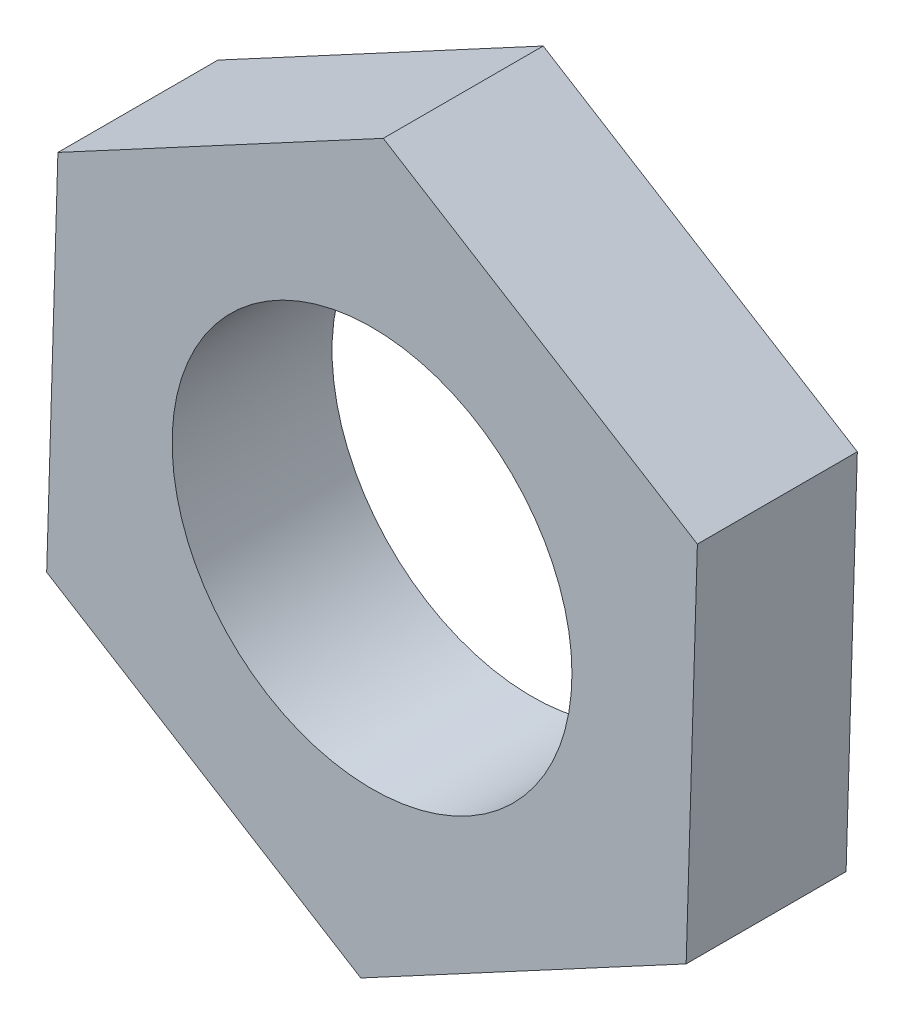
ISO-10303-21;
HEADER;
FILE_DESCRIPTION(('STEP AP214'),'2;1');
FILE_NAME('part.step','',(''),(''),'','','');
FILE_SCHEMA(('AUTOMOTIVE_DESIGN { 1 0 10303 214 1 1 1 1 }'));
ENDSEC;
DATA;
#1=APPLICATION_CONTEXT('core data for automotive mechanical design processes');
#2=APPLICATION_PROTOCOL_DEFINITION('international standard','automotive_design',2000,#1);
#3=PRODUCT_CONTEXT('',#1,'mechanical');
#4=PRODUCT('Part','Part','',(#3));
#5=PRODUCT_RELATED_PRODUCT_CATEGORY('part','',(#4));
#6=PRODUCT_DEFINITION_FORMATION('','',#4);
#7=PRODUCT_DEFINITION_CONTEXT('part definition',#1,'design');
#8=PRODUCT_DEFINITION('design','',#6,#7);
#9=PRODUCT_DEFINITION_SHAPE('','',#8);
#10=(LENGTH_UNIT() NAMED_UNIT(*) SI_UNIT(.MILLI.,.METRE.));
#11=(NAMED_UNIT(*) PLANE_ANGLE_UNIT() SI_UNIT($,.RADIAN.));
#12=(NAMED_UNIT(*) SI_UNIT($,.STERADIAN.) SOLID_ANGLE_UNIT());
#13=UNCERTAINTY_MEASURE_WITH_UNIT(LENGTH_MEASURE(1.E-05),#10,'distance_accuracy_value','');
#14=(GEOMETRIC_REPRESENTATION_CONTEXT(3) GLOBAL_UNCERTAINTY_ASSIGNED_CONTEXT((#13)) GLOBAL_UNIT_ASSIGNED_CONTEXT((#10,
#11,#12)) REPRESENTATION_CONTEXT('',''));
#15=CARTESIAN_POINT('',(0.,0.,0.));
#16=DIRECTION('',(0.,0.,1.));
#17=DIRECTION('',(1.,0.,0.));
#18=AXIS2_PLACEMENT_3D('',#15,#16,#17);
#19=CARTESIAN_POINT('',(0.,0.,20.));
#20=DIRECTION('',(0.,0.,1.));
#21=DIRECTION('',(1.,0.,0.));
#22=AXIS2_PLACEMENT_3D('',#19,#20,#21);
#23=PLANE('',#22);
#24=DIRECTION('',(0.0303984350601622,0.99953786078662,0.));
#25=VECTOR('',#24,1.);
#26=CARTESIAN_POINT('',(39.2794926448677,-24.2992755220216,20.));
#27=LINE('',#26,#25);
#28=CARTESIAN_POINT('',(39.2794926448677,-24.2992755220216,20.));
#29=VERTEX_POINT('',#28);
#30=CARTESIAN_POINT('',(40.683536218062,21.8674007172086,20.));
#31=VERTEX_POINT('',#30);
#32=EDGE_CURVE('E129',#29,#31,#27,.T.);
#33=ORIENTED_EDGE('',*,*,#32,.T.);
#34=DIRECTION('',(-0.850425961955486,0.526094747390702,0.));
#35=VECTOR('',#34,1.);
#36=CARTESIAN_POINT('',(40.683536218062,21.8674007172086,20.));
#37=LINE('',#36,#35);
#38=CARTESIAN_POINT('',(1.40404357319425,46.1666762392302,20.));
#39=VERTEX_POINT('',#38);
#40=EDGE_CURVE('E87',#31,#39,#37,.T.);
#41=ORIENTED_EDGE('',*,*,#40,.T.);
#42=DIRECTION('',(-0.880824397015648,-0.473443113395918,0.));
#43=VECTOR('',#42,1.);
#44=CARTESIAN_POINT('',(1.40404357319425,46.1666762392302,20.));
#45=LINE('',#44,#43);
#46=CARTESIAN_POINT('',(-39.2794926448677,24.2992755220216,20.));
#47=VERTEX_POINT('',#46);
#48=EDGE_CURVE('E100',#39,#47,#45,.T.);
#49=ORIENTED_EDGE('',*,*,#48,.T.);
#50=DIRECTION('',(-0.0303984350601624,-0.99953786078662,0.));
#51=VECTOR('',#50,1.);
#52=CARTESIAN_POINT('',(-39.2794926448677,24.2992755220216,20.));
#53=LINE('',#52,#51);
#54=CARTESIAN_POINT('',(-40.6835362180619,-21.8674007172086,20.));
#55=VERTEX_POINT('',#54);
#56=EDGE_CURVE('E94',#47,#55,#53,.T.);
#57=ORIENTED_EDGE('',*,*,#56,.T.);
#58=DIRECTION('',(0.850425961955486,-0.526094747390702,0.));
#59=VECTOR('',#58,1.);
#60=CARTESIAN_POINT('',(-40.6835362180619,-21.8674007172086,20.));
#61=LINE('',#60,#59);
#62=CARTESIAN_POINT('',(-1.40404357319424,-46.1666762392302,20.));
#63=VERTEX_POINT('',#62);
#64=EDGE_CURVE('E98',#55,#63,#61,.T.);
#65=ORIENTED_EDGE('',*,*,#64,.T.);
#66=DIRECTION('',(0.880824397015648,0.473443113395918,0.));
#67=VECTOR('',#66,1.);
#68=CARTESIAN_POINT('',(-1.40404357319424,-46.1666762392302,20.));
#69=LINE('',#68,#67);
#70=EDGE_CURVE('E50',#63,#29,#69,.T.);
#71=ORIENTED_EDGE('',*,*,#70,.T.);
#72=EDGE_LOOP('',(#33,#41,#49,#57,#65,#71));
#73=FACE_BOUND('',#72,.T.);
#74=CARTESIAN_POINT('',(0.,0.,20.));
#75=DIRECTION('',(0.,0.,1.));
#76=DIRECTION('',(1.,0.,0.));
#77=AXIS2_PLACEMENT_3D('',#74,#75,#76);
#78=CIRCLE('',#77,25.);
#79=CARTESIAN_POINT('',(25.,0.,20.));
#80=VERTEX_POINT('',#79);
#81=EDGE_CURVE('E122',#80,#80,#78,.T.);
#82=ORIENTED_EDGE('',*,*,#81,.F.);
#83=EDGE_LOOP('',(#82));
#84=FACE_BOUND('',#83,.T.);
#85=ADVANCED_FACE('F33',(#73,#84),#23,.T.);
#86=CARTESIAN_POINT('',(0.,0.,0.));
#87=DIRECTION('',(0.,0.,1.));
#88=DIRECTION('',(1.,0.,0.));
#89=AXIS2_PLACEMENT_3D('',#86,#87,#88);
#90=PLANE('',#89);
#91=DIRECTION('',(0.0303984350601622,0.99953786078662,0.));
#92=VECTOR('',#91,1.);
#93=CARTESIAN_POINT('',(39.2794926448677,-24.2992755220216,0.));
#94=LINE('',#93,#92);
#95=CARTESIAN_POINT('',(39.2794926448677,-24.2992755220216,0.));
#96=VERTEX_POINT('',#95);
#97=CARTESIAN_POINT('',(40.683536218062,21.8674007172086,0.));
#98=VERTEX_POINT('',#97);
#99=EDGE_CURVE('E118',#96,#98,#94,.T.);
#100=ORIENTED_EDGE('',*,*,#99,.F.);
#101=DIRECTION('',(0.880824397015648,0.473443113395918,0.));
#102=VECTOR('',#101,1.);
#103=CARTESIAN_POINT('',(-1.40404357319424,-46.1666762392302,0.));
#104=LINE('',#103,#102);
#105=CARTESIAN_POINT('',(-1.40404357319424,-46.1666762392302,0.));
#106=VERTEX_POINT('',#105);
#107=EDGE_CURVE('E79',#106,#96,#104,.T.);
#108=ORIENTED_EDGE('',*,*,#107,.F.);
#109=DIRECTION('',(0.850425961955486,-0.526094747390702,0.));
#110=VECTOR('',#109,1.);
#111=CARTESIAN_POINT('',(-40.6835362180619,-21.8674007172086,0.));
#112=LINE('',#111,#110);
#113=CARTESIAN_POINT('',(-40.6835362180619,-21.8674007172086,0.));
#114=VERTEX_POINT('',#113);
#115=EDGE_CURVE('E73',#114,#106,#112,.T.);
#116=ORIENTED_EDGE('',*,*,#115,.F.);
#117=DIRECTION('',(-0.0303984350601624,-0.99953786078662,0.));
#118=VECTOR('',#117,1.);
#119=CARTESIAN_POINT('',(-39.2794926448677,24.2992755220216,0.));
#120=LINE('',#119,#118);
#121=CARTESIAN_POINT('',(-39.2794926448677,24.2992755220216,0.));
#122=VERTEX_POINT('',#121);
#123=EDGE_CURVE('E108',#122,#114,#120,.T.);
#124=ORIENTED_EDGE('',*,*,#123,.F.);
#125=DIRECTION('',(-0.880824397015648,-0.473443113395918,0.));
#126=VECTOR('',#125,1.);
#127=CARTESIAN_POINT('',(1.40404357319425,46.1666762392302,0.));
#128=LINE('',#127,#126);
#129=CARTESIAN_POINT('',(1.40404357319425,46.1666762392302,0.));
#130=VERTEX_POINT('',#129);
#131=EDGE_CURVE('E124',#130,#122,#128,.T.);
#132=ORIENTED_EDGE('',*,*,#131,.F.);
#133=DIRECTION('',(-0.850425961955486,0.526094747390702,0.));
#134=VECTOR('',#133,1.);
#135=CARTESIAN_POINT('',(40.683536218062,21.8674007172086,0.));
#136=LINE('',#135,#134);
#137=EDGE_CURVE('E121',#98,#130,#136,.T.);
#138=ORIENTED_EDGE('',*,*,#137,.F.);
#139=EDGE_LOOP('',(#100,#108,#116,#124,#132,#138));
#140=FACE_BOUND('',#139,.T.);
#141=CARTESIAN_POINT('',(0.,0.,0.));
#142=DIRECTION('',(0.,0.,1.));
#143=DIRECTION('',(1.,0.,0.));
#144=AXIS2_PLACEMENT_3D('',#141,#142,#143);
#145=CIRCLE('',#144,25.);
#146=CARTESIAN_POINT('',(25.,0.,0.));
#147=VERTEX_POINT('',#146);
#148=EDGE_CURVE('E222',#147,#147,#145,.T.);
#149=ORIENTED_EDGE('',*,*,#148,.T.);
#150=EDGE_LOOP('',(#149));
#151=FACE_BOUND('',#150,.T.);
#152=ADVANCED_FACE('F138',(#140,#151),#90,.F.);
#153=CARTESIAN_POINT('',(39.2794926448677,-24.2992755220216,20.));
#154=DIRECTION('',(-0.99953786078662,0.0303984350601622,0.));
#155=DIRECTION('',(-0.0303984350601622,-0.99953786078662,0.));
#156=AXIS2_PLACEMENT_3D('',#153,#154,#155);
#157=PLANE('',#156);
#158=ORIENTED_EDGE('',*,*,#99,.T.);
#159=DIRECTION('',(0.,0.,-1.));
#160=VECTOR('',#159,1.);
#161=CARTESIAN_POINT('',(40.683536218062,21.8674007172086,20.));
#162=LINE('',#161,#160);
#163=EDGE_CURVE('E11',#31,#98,#162,.T.);
#164=ORIENTED_EDGE('',*,*,#163,.F.);
#165=ORIENTED_EDGE('',*,*,#32,.F.);
#166=DIRECTION('',(0.,0.,-1.));
#167=VECTOR('',#166,1.);
#168=CARTESIAN_POINT('',(39.2794926448677,-24.2992755220216,20.));
#169=LINE('',#168,#167);
#170=EDGE_CURVE('E114',#29,#96,#169,.T.);
#171=ORIENTED_EDGE('',*,*,#170,.T.);
#172=EDGE_LOOP('',(#158,#164,#165,#171));
#173=FACE_BOUND('',#172,.T.);
#174=ADVANCED_FACE('F35',(#173),#157,.F.);
#175=CARTESIAN_POINT('',(40.683536218062,21.8674007172086,20.));
#176=DIRECTION('',(-0.526094747390702,-0.850425961955486,0.));
#177=DIRECTION('',(0.850425961955486,-0.526094747390702,0.));
#178=AXIS2_PLACEMENT_3D('',#175,#176,#177);
#179=PLANE('',#178);
#180=ORIENTED_EDGE('',*,*,#137,.T.);
#181=DIRECTION('',(0.,0.,-1.));
#182=VECTOR('',#181,1.);
#183=CARTESIAN_POINT('',(1.40404357319425,46.1666762392302,20.));
#184=LINE('',#183,#182);
#185=EDGE_CURVE('E42',#39,#130,#184,.T.);
#186=ORIENTED_EDGE('',*,*,#185,.F.);
#187=ORIENTED_EDGE('',*,*,#40,.F.);
#188=ORIENTED_EDGE('',*,*,#163,.T.);
#189=EDGE_LOOP('',(#180,#186,#187,#188));
#190=FACE_BOUND('',#189,.T.);
#191=ADVANCED_FACE('F163',(#190),#179,.F.);
#192=CARTESIAN_POINT('',(1.40404357319425,46.1666762392302,20.));
#193=DIRECTION('',(0.473443113395918,-0.880824397015648,0.));
#194=DIRECTION('',(0.880824397015648,0.473443113395918,0.));
#195=AXIS2_PLACEMENT_3D('',#192,#193,#194);
#196=PLANE('',#195);
#197=ORIENTED_EDGE('',*,*,#131,.T.);
#198=DIRECTION('',(0.,0.,-1.));
#199=VECTOR('',#198,1.);
#200=CARTESIAN_POINT('',(-39.2794926448677,24.2992755220216,20.));
#201=LINE('',#200,#199);
#202=EDGE_CURVE('E109',#47,#122,#201,.T.);
#203=ORIENTED_EDGE('',*,*,#202,.F.);
#204=ORIENTED_EDGE('',*,*,#48,.F.);
#205=ORIENTED_EDGE('',*,*,#185,.T.);
#206=EDGE_LOOP('',(#197,#203,#204,#205));
#207=FACE_BOUND('',#206,.T.);
#208=ADVANCED_FACE('F135',(#207),#196,.F.);
#209=CARTESIAN_POINT('',(-39.2794926448677,24.2992755220216,20.));
#210=DIRECTION('',(0.99953786078662,-0.0303984350601624,0.));
#211=DIRECTION('',(0.0303984350601624,0.99953786078662,0.));
#212=AXIS2_PLACEMENT_3D('',#209,#210,#211);
#213=PLANE('',#212);
#214=ORIENTED_EDGE('',*,*,#123,.T.);
#215=DIRECTION('',(0.,0.,-1.));
#216=VECTOR('',#215,1.);
#217=CARTESIAN_POINT('',(-40.6835362180619,-21.8674007172086,20.));
#218=LINE('',#217,#216);
#219=EDGE_CURVE('E105',#55,#114,#218,.T.);
#220=ORIENTED_EDGE('',*,*,#219,.F.);
#221=ORIENTED_EDGE('',*,*,#56,.F.);
#222=ORIENTED_EDGE('',*,*,#202,.T.);
#223=EDGE_LOOP('',(#214,#220,#221,#222));
#224=FACE_BOUND('',#223,.T.);
#225=ADVANCED_FACE('F106',(#224),#213,.F.);
#226=CARTESIAN_POINT('',(-40.6835362180619,-21.8674007172086,20.));
#227=DIRECTION('',(0.526094747390702,0.850425961955486,0.));
#228=DIRECTION('',(-0.850425961955486,0.526094747390702,0.));
#229=AXIS2_PLACEMENT_3D('',#226,#227,#228);
#230=PLANE('',#229);
#231=ORIENTED_EDGE('',*,*,#115,.T.);
#232=DIRECTION('',(0.,0.,-1.));
#233=VECTOR('',#232,1.);
#234=CARTESIAN_POINT('',(-1.40404357319424,-46.1666762392302,20.));
#235=LINE('',#234,#233);
#236=EDGE_CURVE('E110',#63,#106,#235,.T.);
#237=ORIENTED_EDGE('',*,*,#236,.F.);
#238=ORIENTED_EDGE('',*,*,#64,.F.);
#239=ORIENTED_EDGE('',*,*,#219,.T.);
#240=EDGE_LOOP('',(#231,#237,#238,#239));
#241=FACE_BOUND('',#240,.T.);
#242=ADVANCED_FACE('F112',(#241),#230,.F.);
#243=CARTESIAN_POINT('',(-1.40404357319424,-46.1666762392302,20.));
#244=DIRECTION('',(-0.473443113395918,0.880824397015648,0.));
#245=DIRECTION('',(-0.880824397015648,-0.473443113395918,0.));
#246=AXIS2_PLACEMENT_3D('',#243,#244,#245);
#247=PLANE('',#246);
#248=ORIENTED_EDGE('',*,*,#107,.T.);
#249=ORIENTED_EDGE('',*,*,#170,.F.);
#250=ORIENTED_EDGE('',*,*,#70,.F.);
#251=ORIENTED_EDGE('',*,*,#236,.T.);
#252=EDGE_LOOP('',(#248,#249,#250,#251));
#253=FACE_BOUND('',#252,.T.);
#254=ADVANCED_FACE('F143',(#253),#247,.F.);
#255=CARTESIAN_POINT('',(0.,0.,20.));
#256=DIRECTION('',(0.,0.,-1.));
#257=DIRECTION('',(-1.,0.,0.));
#258=AXIS2_PLACEMENT_3D('',#255,#256,#257);
#259=CYLINDRICAL_SURFACE('',#258,25.);
#260=ORIENTED_EDGE('',*,*,#81,.T.);
#261=EDGE_LOOP('',(#260));
#262=FACE_BOUND('',#261,.T.);
#263=ORIENTED_EDGE('',*,*,#148,.F.);
#264=EDGE_LOOP('',(#263));
#265=FACE_BOUND('',#264,.T.);
#266=ADVANCED_FACE('F145',(#262,#265),#259,.F.);
#267=CLOSED_SHELL('',(#85,#152,#174,#191,#208,#225,#242,#254,#266));
#268=MANIFOLD_SOLID_BREP('B2',#267);
#269=ADVANCED_BREP_SHAPE_REPRESENTATION('',(#18,#268),#14);
#270=SHAPE_DEFINITION_REPRESENTATION(#9,#269);
ENDSEC;
END-ISO-10303-21;
